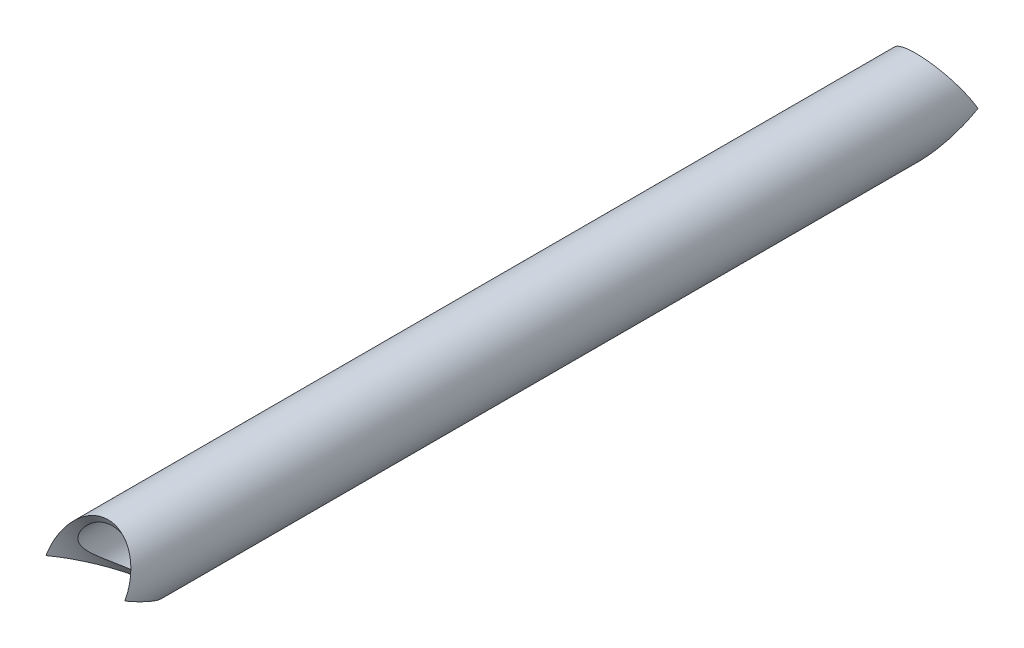
ISO-10303-21;
HEADER;
FILE_DESCRIPTION(('STEP AP214'),'2;1');
FILE_NAME('part.step','',(''),(''),'','','');
FILE_SCHEMA(('AUTOMOTIVE_DESIGN { 1 0 10303 214 1 1 1 1 }'));
ENDSEC;
DATA;
#1=APPLICATION_CONTEXT('core data for automotive mechanical design processes');
#2=APPLICATION_PROTOCOL_DEFINITION('international standard','automotive_design',2000,#1);
#3=PRODUCT_CONTEXT('',#1,'mechanical');
#4=PRODUCT('Part','Part','',(#3));
#5=PRODUCT_RELATED_PRODUCT_CATEGORY('part','',(#4));
#6=PRODUCT_DEFINITION_FORMATION('','',#4);
#7=PRODUCT_DEFINITION_CONTEXT('part definition',#1,'design');
#8=PRODUCT_DEFINITION('design','',#6,#7);
#9=PRODUCT_DEFINITION_SHAPE('','',#8);
#10=(LENGTH_UNIT() NAMED_UNIT(*) SI_UNIT(.MILLI.,.METRE.));
#11=(NAMED_UNIT(*) PLANE_ANGLE_UNIT() SI_UNIT($,.RADIAN.));
#12=(NAMED_UNIT(*) SI_UNIT($,.STERADIAN.) SOLID_ANGLE_UNIT());
#13=UNCERTAINTY_MEASURE_WITH_UNIT(LENGTH_MEASURE(1.E-05),#10,'distance_accuracy_value','');
#14=(GEOMETRIC_REPRESENTATION_CONTEXT(3) GLOBAL_UNCERTAINTY_ASSIGNED_CONTEXT((#13)) GLOBAL_UNIT_ASSIGNED_CONTEXT((#10,
#11,#12)) REPRESENTATION_CONTEXT('',''));
#15=CARTESIAN_POINT('',(0.,0.,0.));
#16=DIRECTION('',(0.,0.,1.));
#17=DIRECTION('',(1.,0.,0.));
#18=AXIS2_PLACEMENT_3D('',#15,#16,#17);
#19=CARTESIAN_POINT('',(9.0632736305644E-13,-189.930080756955,-134.657183252167));
#20=DIRECTION('',(0.,0.,1.));
#21=DIRECTION('',(1.,0.,0.));
#22=AXIS2_PLACEMENT_3D('',#19,#20,#21);
#23=CYLINDRICAL_SURFACE('',#22,10.65);
#24=CARTESIAN_POINT('',(7.08835079549431E-13,-189.930080756955,-115.343816747755));
#25=DIRECTION('',(0.,0.866025403784403,0.500000000000061));
#26=DIRECTION('',(0.,-0.500000000000061,0.866025403784403));
#27=AXIS2_PLACEMENT_3D('',#24,#25,#26);
#28=ELLIPSE('',#27,21.2999999999974,10.65);
#29=CARTESIAN_POINT('',(-10.6499999999993,-189.930080756955,-115.343816747755));
#30=VERTEX_POINT('',#29);
#31=CARTESIAN_POINT('',(10.6500000000007,-189.930080756955,-115.343816747755));
#32=VERTEX_POINT('',#31);
#33=EDGE_CURVE('E46',#30,#32,#28,.T.);
#34=ORIENTED_EDGE('',*,*,#33,.T.);
#35=CARTESIAN_POINT('',(7.08835079549431E-13,-189.930080756955,-115.343816747755));
#36=DIRECTION('',(0.,-0.500000000000061,0.866025403784403));
#37=DIRECTION('',(0.,0.866025403784403,0.500000000000061));
#38=AXIS2_PLACEMENT_3D('',#35,#36,#37);
#39=ELLIPSE('',#38,12.2975607337395,10.65);
#40=EDGE_CURVE('E54',#32,#30,#39,.T.);
#41=ORIENTED_EDGE('',*,*,#40,.T.);
#42=EDGE_LOOP('',(#34,#41));
#43=FACE_BOUND('',#42,.T.);
#44=CARTESIAN_POINT('',(7.08835079549431E-13,-189.930080756955,115.343816747755));
#45=DIRECTION('',(0.,-0.866025403784403,0.500000000000061));
#46=DIRECTION('',(0.,-0.500000000000061,-0.866025403784403));
#47=AXIS2_PLACEMENT_3D('',#44,#45,#46);
#48=ELLIPSE('',#47,21.2999999999974,10.65);
#49=CARTESIAN_POINT('',(-10.6499999999993,-189.930080756955,115.343816747755));
#50=VERTEX_POINT('',#49);
#51=CARTESIAN_POINT('',(10.6500000000007,-189.930080756955,115.343816747755));
#52=VERTEX_POINT('',#51);
#53=EDGE_CURVE('E64',#50,#52,#48,.T.);
#54=ORIENTED_EDGE('',*,*,#53,.F.);
#55=CARTESIAN_POINT('',(7.08835079549431E-13,-189.930080756955,115.343816747755));
#56=DIRECTION('',(0.,0.500000000000061,0.866025403784403));
#57=DIRECTION('',(0.,0.866025403784403,-0.500000000000061));
#58=AXIS2_PLACEMENT_3D('',#55,#56,#57);
#59=ELLIPSE('',#58,12.2975607337395,10.65);
#60=EDGE_CURVE('E62',#52,#50,#59,.T.);
#61=ORIENTED_EDGE('',*,*,#60,.F.);
#62=EDGE_LOOP('',(#54,#61));
#63=FACE_BOUND('',#62,.T.);
#64=ADVANCED_FACE('F35',(#43,#63),#23,.T.);
#65=CARTESIAN_POINT('',(9.0632736305644E-13,-189.930080756955,-134.657183252167));
#66=DIRECTION('',(0.,0.,1.));
#67=DIRECTION('',(1.,0.,0.));
#68=AXIS2_PLACEMENT_3D('',#65,#66,#67);
#69=CYLINDRICAL_SURFACE('',#68,8.65);
#70=CARTESIAN_POINT('',(8.6500000000009,-189.930080756955,-108.169789519855));
#71=CARTESIAN_POINT('',(8.64999937803417,-189.783264674996,-108.254553812138));
#72=CARTESIAN_POINT('',(8.64626274910797,-189.633836481742,-108.334805870728));
#73=CARTESIAN_POINT('',(8.63051404007097,-189.330231408405,-108.484871683348));
#74=CARTESIAN_POINT('',(8.61850310980596,-189.176055190979,-108.554686886105));
#75=CARTESIAN_POINT('',(8.58549136002999,-188.864058425133,-108.682598958273));
#76=CARTESIAN_POINT('',(8.56450206368847,-188.706242792461,-108.740710708202));
#77=CARTESIAN_POINT('',(8.51297710355514,-188.388108659806,-108.844571007219));
#78=CARTESIAN_POINT('',(8.48244146927685,-188.227790167563,-108.890319594529));
#79=CARTESIAN_POINT('',(8.41148621828009,-187.906085352033,-108.969357821528));
#80=CARTESIAN_POINT('',(8.37105601253881,-187.744698066168,-109.002634016221));
#81=CARTESIAN_POINT('',(8.28030697487786,-187.422691275324,-109.057180023759));
#82=CARTESIAN_POINT('',(8.22998781020981,-187.262071796367,-109.0784494325));
#83=CARTESIAN_POINT('',(8.1195591828893,-186.94279898659,-109.110075644665));
#84=CARTESIAN_POINT('',(8.05943008935801,-186.784150299099,-109.120410249233));
#85=CARTESIAN_POINT('',(7.92980127102055,-186.470371161378,-109.131499808874));
#86=CARTESIAN_POINT('',(7.86029883349751,-186.315241744892,-109.132251984681));
#87=CARTESIAN_POINT('',(7.69251740767406,-185.96851090789,-109.124832714029));
#88=CARTESIAN_POINT('',(7.59151815094422,-185.778276477436,-109.114215818048));
#89=CARTESIAN_POINT('',(7.37601667855969,-185.406465672014,-109.083110507501));
#90=CARTESIAN_POINT('',(7.26151062378823,-185.224891779378,-109.062619281164));
#91=CARTESIAN_POINT('',(7.01974442801529,-184.871266755584,-109.014496823818));
#92=CARTESIAN_POINT('',(6.89247464409807,-184.699222979025,-108.986860169229));
#93=CARTESIAN_POINT('',(6.62602035216196,-184.365555584953,-108.926814802504));
#94=CARTESIAN_POINT('',(6.48683667995992,-184.203931237859,-108.894406425013));
#95=CARTESIAN_POINT('',(6.19369921715808,-183.887881348023,-108.825971691326));
#96=CARTESIAN_POINT('',(6.03946719637315,-183.733729014745,-108.789876171454));
#97=CARTESIAN_POINT('',(5.71996280968022,-183.437626174971,-108.716544919955));
#98=CARTESIAN_POINT('',(5.55469039583224,-183.295675721465,-108.679309183378));
#99=CARTESIAN_POINT('',(5.21389860048005,-183.024637527607,-108.605207766052));
#100=CARTESIAN_POINT('',(5.03838164400037,-182.895546762615,-108.568342000129));
#101=CARTESIAN_POINT('',(4.67787691764227,-182.650833994149,-108.496242664774));
#102=CARTESIAN_POINT('',(4.49288897525264,-182.535212236134,-108.461009125096));
#103=CARTESIAN_POINT('',(4.0896393572084,-182.303930255912,-108.388840354413));
#104=CARTESIAN_POINT('',(3.87018262639338,-182.190227595623,-108.352281476196));
#105=CARTESIAN_POINT('',(3.42170434916217,-181.981773276058,-108.283945399977));
#106=CARTESIAN_POINT('',(3.19268197861236,-181.887023253746,-108.252168615069));
#107=CARTESIAN_POINT('',(2.72667233822174,-181.717331774712,-108.194467434728));
#108=CARTESIAN_POINT('',(2.48968464132819,-181.642391381978,-108.168543353658));
#109=CARTESIAN_POINT('',(2.00954587057645,-181.513072445296,-108.123393090809));
#110=CARTESIAN_POINT('',(1.76639521489101,-181.458692510231,-108.104166455888));
#111=CARTESIAN_POINT('',(1.28688815578066,-181.373034380647,-108.073718575009));
#112=CARTESIAN_POINT('',(1.05071773862644,-181.34082751511,-108.062176292036));
#113=CARTESIAN_POINT('',(0.576287751522943,-181.296011057647,-108.046083469695));
#114=CARTESIAN_POINT('',(0.338028232849858,-181.283400986072,-108.041532759202));
#115=CARTESIAN_POINT('',(-0.138694398065081,-181.27790894676,-108.039552924523));
#116=CARTESIAN_POINT('',(-0.377157454409495,-181.285022666651,-108.042122243627));
#117=CARTESIAN_POINT('',(-0.852499060907773,-181.318895198817,-108.054306138062));
#118=CARTESIAN_POINT('',(-1.08937763949893,-181.345653657561,-108.063920586606));
#119=CARTESIAN_POINT('',(-1.55084699909946,-181.417160272854,-108.089426565679));
#120=CARTESIAN_POINT('',(-1.77556361879871,-181.461189550589,-108.105066862876));
#121=CARTESIAN_POINT('',(-2.22033596035068,-181.56677702168,-108.142195625824));
#122=CARTESIAN_POINT('',(-2.44039182888853,-181.628334662492,-108.163683907229));
#123=CARTESIAN_POINT('',(-2.87439182216372,-181.768440967908,-108.211923088911));
#124=CARTESIAN_POINT('',(-3.08833678882489,-181.846987279006,-108.238673260194));
#125=CARTESIAN_POINT('',(-3.50884695014988,-182.020451930229,-108.296692885499));
#126=CARTESIAN_POINT('',(-3.71541192514845,-182.115370757192,-108.327962473902));
#127=CARTESIAN_POINT('',(-4.12561504865862,-182.323755254148,-108.395031462139));
#128=CARTESIAN_POINT('',(-4.32901148650067,-182.437663816104,-108.430932760369));
#129=CARTESIAN_POINT('',(-4.72560996425136,-182.681268767221,-108.505363145942));
#130=CARTESIAN_POINT('',(-4.91881176220126,-182.810965530856,-108.543892295604));
#131=CARTESIAN_POINT('',(-5.29426000335195,-183.085558733724,-108.622226257415));
#132=CARTESIAN_POINT('',(-5.47649012979038,-183.230476972353,-108.662032840823));
#133=CARTESIAN_POINT('',(-5.82873985001055,-183.534579536099,-108.741182784621));
#134=CARTESIAN_POINT('',(-5.99875927649411,-183.69376405661,-108.780526138658));
#135=CARTESIAN_POINT('',(-6.33518765876964,-184.035283085524,-108.858947720858));
#136=CARTESIAN_POINT('',(-6.50081325634355,-184.218425197733,-108.897877805572));
#137=CARTESIAN_POINT('',(-6.81634213928475,-184.598939018006,-108.970062290426));
#138=CARTESIAN_POINT('',(-6.96624167784238,-184.796314098326,-109.003315339162));
#139=CARTESIAN_POINT('',(-7.24880778216951,-185.203706994468,-109.060509557228));
#140=CARTESIAN_POINT('',(-7.38151120832184,-185.413696307143,-109.084470871124));
#141=CARTESIAN_POINT('',(-7.62872444595231,-185.845138231175,-109.118913729455));
#142=CARTESIAN_POINT('',(-7.74324661530684,-186.066582919356,-109.129404464573));
#143=CARTESIAN_POINT('',(-7.9158766152872,-186.439021957776,-109.131660793055));
#144=CARTESIAN_POINT('',(-7.97965328460061,-186.587379578665,-109.128717442631));
#145=CARTESIAN_POINT('',(-8.09865941914336,-186.887027428737,-109.113865684182));
#146=CARTESIAN_POINT('',(-8.15389168150528,-187.038316679883,-109.101960217552));
#147=CARTESIAN_POINT('',(-8.25543809691455,-187.342438268084,-109.068058126733));
#148=CARTESIAN_POINT('',(-8.30176915263701,-187.495267088722,-109.046080902259));
#149=CARTESIAN_POINT('',(-8.38549388456829,-187.801425095008,-108.99119286605));
#150=CARTESIAN_POINT('',(-8.42288752849188,-187.95475428246,-108.958282014819));
#151=CARTESIAN_POINT('',(-8.48887463244731,-188.260918126934,-108.881026848117));
#152=CARTESIAN_POINT('',(-8.51744234753681,-188.413750074128,-108.836649764691));
#153=CARTESIAN_POINT('',(-8.56590540255602,-188.7170837474,-108.736664024626));
#154=CARTESIAN_POINT('',(-8.58580081854648,-188.867585493904,-108.681055466499));
#155=CARTESIAN_POINT('',(-8.61742448664767,-189.165272229515,-108.559202943972));
#156=CARTESIAN_POINT('',(-8.62914387610687,-189.31245345259,-108.492947533978));
#157=CARTESIAN_POINT('',(-8.64501885033527,-189.602561451232,-108.350865711014));
#158=CARTESIAN_POINT('',(-8.64917188259911,-189.745486775085,-108.275036077408));
#159=CARTESIAN_POINT('',(-8.65091176420794,-190.087030620736,-108.080636711765));
#160=CARTESIAN_POINT('',(-8.6449099197872,-190.28318795917,-107.957703743347));
#161=CARTESIAN_POINT('',(-8.62080404537239,-190.665606330808,-107.69839276968));
#162=CARTESIAN_POINT('',(-8.60269349220052,-190.851861971375,-107.562007551242));
#163=CARTESIAN_POINT('',(-8.55591593176056,-191.215588142947,-107.27857318699));
#164=CARTESIAN_POINT('',(-8.5272145391972,-191.393027898152,-107.131490572933));
#165=CARTESIAN_POINT('',(-8.46048539057239,-191.73944947881,-106.829617762232));
#166=CARTESIAN_POINT('',(-8.42245385331444,-191.908427841629,-106.674824461024));
#167=CARTESIAN_POINT('',(-8.33930780952848,-192.233482965,-106.36473470451));
#168=CARTESIAN_POINT('',(-8.2944623361026,-192.389800272962,-106.209616629138));
#169=CARTESIAN_POINT('',(-8.19738755509959,-192.696151819373,-105.895606806597));
#170=CARTESIAN_POINT('',(-8.14515935111339,-192.846186992556,-105.73671562639));
#171=CARTESIAN_POINT('',(-8.03358147622542,-193.140828955438,-105.416145966448));
#172=CARTESIAN_POINT('',(-7.97422521882651,-193.285430559903,-105.25446502886));
#173=CARTESIAN_POINT('',(-7.84858289044724,-193.569639355006,-104.929390007646));
#174=CARTESIAN_POINT('',(-7.7822960538325,-193.709245991549,-104.765995736541));
#175=CARTESIAN_POINT('',(-7.64278789689105,-193.983972723712,-104.438214400627));
#176=CARTESIAN_POINT('',(-7.56956237191807,-194.119090031087,-104.273826791096));
#177=CARTESIAN_POINT('',(-7.41613086611487,-194.385086648004,-103.94485285179));
#178=CARTESIAN_POINT('',(-7.33592422353037,-194.515965554162,-103.780266504639));
#179=CARTESIAN_POINT('',(-7.16842967186039,-194.77360305074,-103.451680828192));
#180=CARTESIAN_POINT('',(-7.08114669097882,-194.900364424026,-103.287681172015));
#181=CARTESIAN_POINT('',(-6.89920629382284,-195.149975224742,-102.960798311949));
#182=CARTESIAN_POINT('',(-6.80454875726894,-195.27282458832,-102.797915126316));
#183=CARTESIAN_POINT('',(-6.56519981119171,-195.566605524496,-102.40428389218));
#184=CARTESIAN_POINT('',(-6.41648661666436,-195.7355148502,-102.17444941504));
#185=CARTESIAN_POINT('',(-6.10210401419073,-196.065119377039,-101.720441483567));
#186=CARTESIAN_POINT('',(-5.93643204735787,-196.225813333067,-101.496268889929));
#187=CARTESIAN_POINT('',(-5.58706670598611,-196.537796432091,-101.05665010599));
#188=CARTESIAN_POINT('',(-5.40341885193458,-196.689107823162,-100.841183730397));
#189=CARTESIAN_POINT('',(-5.01605964050903,-196.981356654879,-100.421588491406));
#190=CARTESIAN_POINT('',(-4.81235869354333,-197.122299412607,-100.217453830422));
#191=CARTESIAN_POINT('',(-4.4639543153773,-197.340916757968,-99.8986979964682));
#192=CARTESIAN_POINT('',(-4.32596965085751,-197.42240729232,-99.7793498344447));
#193=CARTESIAN_POINT('',(-4.04104693269411,-197.579848974194,-99.5479148246745));
#194=CARTESIAN_POINT('',(-3.89410768993987,-197.655799383068,-99.4358289454077));
#195=CARTESIAN_POINT('',(-3.4395362282074,-197.873944188166,-99.1128683237676));
#196=CARTESIAN_POINT('',(-3.11767000653522,-198.00674128604,-98.9148381206735));
#197=CARTESIAN_POINT('',(-2.51329904826328,-198.211567578748,-98.6081351365987));
#198=CARTESIAN_POINT('',(-2.23837288737234,-198.290547803417,-98.4893822395522));
#199=CARTESIAN_POINT('',(-1.81149183588474,-198.389536700987,-98.3402307692878));
#200=CARTESIAN_POINT('',(-1.6667769628438,-198.41928686878,-98.2953420807146));
#201=CARTESIAN_POINT('',(-1.3732376326574,-198.471679420336,-98.2162210175355));
#202=CARTESIAN_POINT('',(-1.22441515227342,-198.494325160344,-98.181983611158));
#203=CARTESIAN_POINT('',(-0.922228530534084,-198.532138309608,-98.1247830542755));
#204=CARTESIAN_POINT('',(-0.768835207761977,-198.547235025687,-98.1019264882869));
#205=CARTESIAN_POINT('',(-0.46011120993838,-198.569220722579,-98.068631455004));
#206=CARTESIAN_POINT('',(-0.304780550295992,-198.576109768632,-98.0581928890036));
#207=CARTESIAN_POINT('',(0.00631804623187532,-198.581476991314,-98.0500607025686));
#208=CARTESIAN_POINT('',(0.162085851107491,-198.5799574806,-98.0523635777774));
#209=CARTESIAN_POINT('',(0.472597570433522,-198.568557828703,-98.069633936411));
#210=CARTESIAN_POINT('',(0.627341552835046,-198.558678248104,-98.0846005706693));
#211=CARTESIAN_POINT('',(0.914629127249763,-198.532638689337,-98.1240216912087));
#212=CARTESIAN_POINT('',(1.04746675019335,-198.517450654638,-98.1470071670895));
#213=CARTESIAN_POINT('',(1.31053948151426,-198.481258248787,-98.2017371636456));
#214=CARTESIAN_POINT('',(1.4407737859712,-198.460252109833,-98.2334843465095));
#215=CARTESIAN_POINT('',(1.8265094283439,-198.389077764845,-98.3409455682366));
#216=CARTESIAN_POINT('',(2.07716005820184,-198.330742558399,-98.4288961060872));
#217=CARTESIAN_POINT('',(2.677010449642,-198.163787493924,-98.6798415466375));
#218=CARTESIAN_POINT('',(3.01657143771907,-198.04444052964,-98.8586449484407));
#219=CARTESIAN_POINT('',(3.4969438802439,-197.843627765568,-99.1575546718874));
#220=CARTESIAN_POINT('',(3.65245291749773,-197.772934680177,-99.2624906726672));
#221=CARTESIAN_POINT('',(3.95415605806277,-197.625228633007,-99.4809699570006));
#222=CARTESIAN_POINT('',(4.10035178316956,-197.548216776936,-99.5945117343848));
#223=CARTESIAN_POINT('',(4.47217067277796,-197.338994382108,-99.9017383815067));
#224=CARTESIAN_POINT('',(4.69046621582164,-197.202312631268,-100.101242865584));
#225=CARTESIAN_POINT('',(5.10542040242059,-196.917252986393,-100.513982184383));
#226=CARTESIAN_POINT('',(5.30206445824787,-196.768867320966,-100.727226124592));
#227=CARTESIAN_POINT('',(5.67619689273809,-196.461701005763,-101.164384294701));
#228=CARTESIAN_POINT('',(5.85361633779509,-196.302886028447,-101.388333025683));
#229=CARTESIAN_POINT('',(6.19021131260067,-195.976462879584,-101.843247922683));
#230=CARTESIAN_POINT('',(6.34939068741001,-195.808856572177,-102.074212596685));
#231=CARTESIAN_POINT('',(6.61712450602791,-195.503908562381,-102.488481148718));
#232=CARTESIAN_POINT('',(6.72902472853625,-195.368213027809,-102.670852703075));
#233=CARTESIAN_POINT('',(6.94326792392789,-195.091873656927,-103.037486844069));
#234=CARTESIAN_POINT('',(7.04560988610163,-194.95122929948,-103.221749628406));
#235=CARTESIAN_POINT('',(7.24122557898553,-194.664768028116,-103.591407563522));
#236=CARTESIAN_POINT('',(7.33449006193127,-194.518946041586,-103.77680366875));
#237=CARTESIAN_POINT('',(7.51210861764743,-194.222009786335,-104.147609115909));
#238=CARTESIAN_POINT('',(7.59646314201745,-194.070895786358,-104.333018456692));
#239=CARTESIAN_POINT('',(7.7562033711046,-193.763325616376,-104.702402158837));
#240=CARTESIAN_POINT('',(7.83161100983245,-193.606883774214,-104.886378951162));
#241=CARTESIAN_POINT('',(7.97368173187842,-193.287673332181,-105.25226324286));
#242=CARTESIAN_POINT('',(8.04034383363496,-193.124904024795,-105.434170507868));
#243=CARTESIAN_POINT('',(8.16459670931799,-192.792476491618,-105.794291758842));
#244=CARTESIAN_POINT('',(8.22219981237354,-192.622828031039,-105.972510472711));
#245=CARTESIAN_POINT('',(8.3279413403157,-192.275470820415,-106.323768111329));
#246=CARTESIAN_POINT('',(8.37608284212318,-192.097764713938,-106.496808704437));
#247=CARTESIAN_POINT('',(8.45472823516557,-191.764250235384,-106.806582126786));
#248=CARTESIAN_POINT('',(8.48684042867091,-191.609892877515,-106.944464161029));
#249=CARTESIAN_POINT('',(8.54328935211283,-191.294062265692,-107.213577397716));
#250=CARTESIAN_POINT('',(8.56762596647598,-191.132588906008,-107.344808501278));
#251=CARTESIAN_POINT('',(8.60751619567218,-190.80229955061,-107.598297745807));
#252=CARTESIAN_POINT('',(8.62309164938136,-190.633502952202,-107.720577531134));
#253=CARTESIAN_POINT('',(8.64433263886671,-190.287817579566,-107.954115038892));
#254=CARTESIAN_POINT('',(8.65000076614854,-190.110930933916,-108.065375636479));
#255=CARTESIAN_POINT('',(8.6500000000009,-189.930080756955,-108.169789519855));
#256=B_SPLINE_CURVE_WITH_KNOTS('',3,(#70,#71,#72,#73,#74,#75,#76,#77,#78,#79,#80,#81,#82,#83,
#84,#85,#86,#87,#88,#89,#90,#91,#92,#93,#94,#95,#96,#97,#98,#99,#100,#101,#102,#103,#104,#105,
#106,#107,#108,#109,#110,#111,#112,#113,#114,#115,#116,#117,#118,#119,#120,#121,#122,#123,#124,
#125,#126,#127,#128,#129,#130,#131,#132,#133,#134,#135,#136,#137,#138,#139,#140,#141,#142,#143,
#144,#145,#146,#147,#148,#149,#150,#151,#152,#153,#154,#155,#156,#157,#158,#159,#160,#161,#162,
#163,#164,#165,#166,#167,#168,#169,#170,#171,#172,#173,#174,#175,#176,#177,#178,#179,#180,#181,
#182,#183,#184,#185,#186,#187,#188,#189,#190,#191,#192,#193,#194,#195,#196,#197,#198,#199,#200,
#201,#202,#203,#204,#205,#206,#207,#208,#209,#210,#211,#212,#213,#214,#215,#216,#217,#218,#219,
#220,#221,#222,#223,#224,#225,#226,#227,#228,#229,#230,#231,#232,#233,#234,#235,#236,#237,#238,
#239,#240,#241,#242,#243,#244,#245,#246,#247,#248,#249,#250,#251,#252,#253,#254,#255),
.UNSPECIFIED.,.T.,.F.,(4,2,2,2,2,2,2,2,2,2,2,2,2,2,2,2,2,2,2,2,2,2,2,2,2,2,2,2,2,2,2,2,2,2,2,2,
2,2,2,2,2,2,2,2,2,2,2,2,2,2,2,2,2,2,2,2,2,2,2,2,2,2,2,2,2,2,2,2,2,2,2,2,2,2,2,2,2,2,2,2,2,2,2,2,
2,2,2,2,2,2,2,2,4),(0.,0.50844506770032,1.01681949312019,1.52454340032978,2.03226573787235,
2.54053382673726,3.04881902097636,3.55813412185317,4.06759693996531,4.71359002947249,
5.35976717786677,6.00643624012414,6.65305997254474,7.3155184468507,7.97797979789332,
8.6402849662054,9.30260220250553,10.0512091879151,10.7998808036044,11.5485926227776,
12.2972537751968,13.0122575701416,13.7272438644487,14.4420738478246,15.156890967233,
15.8446653307736,16.5324180161264,17.2200754854148,17.9077534057857,18.6145823037831,
19.3214279700605,20.029300114905,20.7371819564202,21.4861817527539,22.2353595985674,
22.982904015949,23.7299381285008,24.2140392664682,24.6979815901782,25.180995661056,
25.6640114767329,26.1484232132305,26.6328307010897,27.117762464654,27.6028577893435,
28.2964167818696,28.9903497083937,29.6865557409421,30.3830443900299,31.0569944659832,
31.730843904349,32.4053208577866,33.0798724008736,33.7548353491973,34.4298623484518,
35.1044232089345,35.7789950738538,36.7434305731186,37.7080118098811,38.6702106916392,
39.6319126633935,40.2309613246267,40.8300897097657,42.0261773485565,42.951559231629,
43.4142860297684,43.8767938980604,44.3435554209343,44.8103132336662,45.2769426775157,
45.7435408340744,46.1500870679644,46.5567569645804,47.3697458590114,48.5683011522663,
49.1693990091057,49.7703919045981,50.7462014804333,51.7226645377541,52.7025204724633,
53.6821694691644,54.4420360299657,55.2019828498199,55.962695941976,56.723370459009,
57.4821398028629,58.2409942350118,58.9988067717563,59.7563724579486,60.3844095628078,
61.0124560021507,61.6389298975942,62.2652398987969),.UNSPECIFIED.);
#257=CARTESIAN_POINT('',(8.6500000000009,-189.930080756955,-108.169789519855));
#258=VERTEX_POINT('',#257);
#259=EDGE_CURVE('E11',#258,#258,#256,.T.);
#260=ORIENTED_EDGE('',*,*,#259,.F.);
#261=EDGE_LOOP('',(#260));
#262=FACE_BOUND('',#261,.T.);
#263=CARTESIAN_POINT('',(8.6500000000009,-189.930080756955,108.169789519855));
#264=CARTESIAN_POINT('',(8.64999937803417,-189.783264674996,108.254553812138));
#265=CARTESIAN_POINT('',(8.64626274910797,-189.633836481742,108.334805870728));
#266=CARTESIAN_POINT('',(8.63051404007097,-189.330231408405,108.484871683348));
#267=CARTESIAN_POINT('',(8.61850310980596,-189.176055190979,108.554686886105));
#268=CARTESIAN_POINT('',(8.58549136002999,-188.864058425133,108.682598958273));
#269=CARTESIAN_POINT('',(8.56450206368847,-188.706242792461,108.740710708202));
#270=CARTESIAN_POINT('',(8.51297710355514,-188.388108659806,108.844571007219));
#271=CARTESIAN_POINT('',(8.48244146927685,-188.227790167563,108.890319594529));
#272=CARTESIAN_POINT('',(8.41148621828009,-187.906085352033,108.969357821528));
#273=CARTESIAN_POINT('',(8.37105601253881,-187.744698066168,109.002634016221));
#274=CARTESIAN_POINT('',(8.28030697487786,-187.422691275324,109.057180023759));
#275=CARTESIAN_POINT('',(8.22998781020981,-187.262071796367,109.0784494325));
#276=CARTESIAN_POINT('',(8.1195591828893,-186.94279898659,109.110075644665));
#277=CARTESIAN_POINT('',(8.05943008935801,-186.784150299099,109.120410249233));
#278=CARTESIAN_POINT('',(7.92980127102055,-186.470371161378,109.131499808874));
#279=CARTESIAN_POINT('',(7.86029883349751,-186.315241744892,109.132251984681));
#280=CARTESIAN_POINT('',(7.69251740767406,-185.96851090789,109.124832714029));
#281=CARTESIAN_POINT('',(7.59151815094422,-185.778276477436,109.114215818048));
#282=CARTESIAN_POINT('',(7.37601667855969,-185.406465672014,109.083110507501));
#283=CARTESIAN_POINT('',(7.26151062378823,-185.224891779378,109.062619281164));
#284=CARTESIAN_POINT('',(7.01974442801529,-184.871266755584,109.014496823818));
#285=CARTESIAN_POINT('',(6.89247464409807,-184.699222979025,108.986860169229));
#286=CARTESIAN_POINT('',(6.62602035216196,-184.365555584953,108.926814802504));
#287=CARTESIAN_POINT('',(6.48683667995992,-184.203931237859,108.894406425013));
#288=CARTESIAN_POINT('',(6.19369921715808,-183.887881348023,108.825971691326));
#289=CARTESIAN_POINT('',(6.03946719637315,-183.733729014745,108.789876171454));
#290=CARTESIAN_POINT('',(5.71996280968022,-183.437626174971,108.716544919955));
#291=CARTESIAN_POINT('',(5.55469039583224,-183.295675721465,108.679309183378));
#292=CARTESIAN_POINT('',(5.21389860048005,-183.024637527607,108.605207766052));
#293=CARTESIAN_POINT('',(5.03838164400037,-182.895546762615,108.568342000129));
#294=CARTESIAN_POINT('',(4.67787691764227,-182.650833994149,108.496242664774));
#295=CARTESIAN_POINT('',(4.49288897525264,-182.535212236134,108.461009125096));
#296=CARTESIAN_POINT('',(4.0896393572084,-182.303930255912,108.388840354413));
#297=CARTESIAN_POINT('',(3.87018262639338,-182.190227595623,108.352281476196));
#298=CARTESIAN_POINT('',(3.42170434916217,-181.981773276058,108.283945399977));
#299=CARTESIAN_POINT('',(3.19268197861236,-181.887023253746,108.252168615069));
#300=CARTESIAN_POINT('',(2.72667233822174,-181.717331774712,108.194467434728));
#301=CARTESIAN_POINT('',(2.48968464132819,-181.642391381978,108.168543353658));
#302=CARTESIAN_POINT('',(2.00954587057645,-181.513072445296,108.123393090809));
#303=CARTESIAN_POINT('',(1.76639521489101,-181.458692510231,108.104166455888));
#304=CARTESIAN_POINT('',(1.28688815578066,-181.373034380647,108.073718575009));
#305=CARTESIAN_POINT('',(1.05071773862644,-181.34082751511,108.062176292036));
#306=CARTESIAN_POINT('',(0.576287751522943,-181.296011057647,108.046083469695));
#307=CARTESIAN_POINT('',(0.338028232849858,-181.283400986072,108.041532759202));
#308=CARTESIAN_POINT('',(-0.138694398065081,-181.27790894676,108.039552924523));
#309=CARTESIAN_POINT('',(-0.377157454409495,-181.285022666651,108.042122243627));
#310=CARTESIAN_POINT('',(-0.852499060907773,-181.318895198817,108.054306138062));
#311=CARTESIAN_POINT('',(-1.08937763949893,-181.345653657561,108.063920586606));
#312=CARTESIAN_POINT('',(-1.55084699909946,-181.417160272854,108.089426565679));
#313=CARTESIAN_POINT('',(-1.77556361879871,-181.461189550589,108.105066862876));
#314=CARTESIAN_POINT('',(-2.22033596035068,-181.56677702168,108.142195625824));
#315=CARTESIAN_POINT('',(-2.44039182888853,-181.628334662492,108.163683907229));
#316=CARTESIAN_POINT('',(-2.87439182216372,-181.768440967908,108.211923088911));
#317=CARTESIAN_POINT('',(-3.08833678882489,-181.846987279006,108.238673260194));
#318=CARTESIAN_POINT('',(-3.50884695014988,-182.020451930229,108.296692885499));
#319=CARTESIAN_POINT('',(-3.71541192514845,-182.115370757192,108.327962473902));
#320=CARTESIAN_POINT('',(-4.12561504865862,-182.323755254148,108.395031462139));
#321=CARTESIAN_POINT('',(-4.32901148650067,-182.437663816104,108.430932760369));
#322=CARTESIAN_POINT('',(-4.72560996425136,-182.681268767221,108.505363145942));
#323=CARTESIAN_POINT('',(-4.91881176220126,-182.810965530856,108.543892295604));
#324=CARTESIAN_POINT('',(-5.29426000335195,-183.085558733724,108.622226257415));
#325=CARTESIAN_POINT('',(-5.47649012979038,-183.230476972353,108.662032840823));
#326=CARTESIAN_POINT('',(-5.82873985001055,-183.534579536099,108.741182784621));
#327=CARTESIAN_POINT('',(-5.99875927649411,-183.69376405661,108.780526138658));
#328=CARTESIAN_POINT('',(-6.33518765876964,-184.035283085524,108.858947720858));
#329=CARTESIAN_POINT('',(-6.50081325634355,-184.218425197733,108.897877805572));
#330=CARTESIAN_POINT('',(-6.81634213928475,-184.598939018006,108.970062290426));
#331=CARTESIAN_POINT('',(-6.96624167784238,-184.796314098326,109.003315339162));
#332=CARTESIAN_POINT('',(-7.24880778216951,-185.203706994468,109.060509557228));
#333=CARTESIAN_POINT('',(-7.38151120832184,-185.413696307143,109.084470871124));
#334=CARTESIAN_POINT('',(-7.62872444595231,-185.845138231175,109.118913729455));
#335=CARTESIAN_POINT('',(-7.74324661530684,-186.066582919356,109.129404464573));
#336=CARTESIAN_POINT('',(-7.9158766152872,-186.439021957776,109.131660793055));
#337=CARTESIAN_POINT('',(-7.97965328460061,-186.587379578665,109.128717442631));
#338=CARTESIAN_POINT('',(-8.09865941914336,-186.887027428737,109.113865684182));
#339=CARTESIAN_POINT('',(-8.15389168150528,-187.038316679883,109.101960217552));
#340=CARTESIAN_POINT('',(-8.25543809691455,-187.342438268084,109.068058126733));
#341=CARTESIAN_POINT('',(-8.30176915263701,-187.495267088722,109.046080902259));
#342=CARTESIAN_POINT('',(-8.38549388456829,-187.801425095008,108.99119286605));
#343=CARTESIAN_POINT('',(-8.42288752849188,-187.95475428246,108.958282014819));
#344=CARTESIAN_POINT('',(-8.48887463244731,-188.260918126934,108.881026848117));
#345=CARTESIAN_POINT('',(-8.51744234753681,-188.413750074128,108.836649764691));
#346=CARTESIAN_POINT('',(-8.56590540255602,-188.7170837474,108.736664024626));
#347=CARTESIAN_POINT('',(-8.58580081854648,-188.867585493904,108.681055466499));
#348=CARTESIAN_POINT('',(-8.61742448664767,-189.165272229515,108.559202943972));
#349=CARTESIAN_POINT('',(-8.62914387610687,-189.31245345259,108.492947533978));
#350=CARTESIAN_POINT('',(-8.64501885033527,-189.602561451232,108.350865711014));
#351=CARTESIAN_POINT('',(-8.64917188259911,-189.745486775085,108.275036077408));
#352=CARTESIAN_POINT('',(-8.65091176420794,-190.087030620736,108.080636711765));
#353=CARTESIAN_POINT('',(-8.6449099197872,-190.28318795917,107.957703743347));
#354=CARTESIAN_POINT('',(-8.62080404537239,-190.665606330808,107.69839276968));
#355=CARTESIAN_POINT('',(-8.60269349220052,-190.851861971375,107.562007551242));
#356=CARTESIAN_POINT('',(-8.55591593176056,-191.215588142947,107.27857318699));
#357=CARTESIAN_POINT('',(-8.5272145391972,-191.393027898152,107.131490572933));
#358=CARTESIAN_POINT('',(-8.46048539057239,-191.73944947881,106.829617762232));
#359=CARTESIAN_POINT('',(-8.42245385331444,-191.908427841629,106.674824461024));
#360=CARTESIAN_POINT('',(-8.33930780952848,-192.233482965,106.36473470451));
#361=CARTESIAN_POINT('',(-8.2944623361026,-192.389800272962,106.209616629138));
#362=CARTESIAN_POINT('',(-8.19738755509959,-192.696151819373,105.895606806597));
#363=CARTESIAN_POINT('',(-8.14515935111339,-192.846186992556,105.73671562639));
#364=CARTESIAN_POINT('',(-8.03358147622542,-193.140828955438,105.416145966448));
#365=CARTESIAN_POINT('',(-7.97422521882651,-193.285430559903,105.25446502886));
#366=CARTESIAN_POINT('',(-7.84858289044724,-193.569639355006,104.929390007646));
#367=CARTESIAN_POINT('',(-7.7822960538325,-193.709245991549,104.765995736541));
#368=CARTESIAN_POINT('',(-7.64278789689105,-193.983972723712,104.438214400627));
#369=CARTESIAN_POINT('',(-7.56956237191807,-194.119090031087,104.273826791096));
#370=CARTESIAN_POINT('',(-7.41613086611487,-194.385086648004,103.94485285179));
#371=CARTESIAN_POINT('',(-7.33592422353037,-194.515965554162,103.780266504639));
#372=CARTESIAN_POINT('',(-7.16842967186039,-194.77360305074,103.451680828192));
#373=CARTESIAN_POINT('',(-7.08114669097882,-194.900364424026,103.287681172015));
#374=CARTESIAN_POINT('',(-6.89920629382284,-195.149975224742,102.960798311949));
#375=CARTESIAN_POINT('',(-6.80454875726894,-195.27282458832,102.797915126316));
#376=CARTESIAN_POINT('',(-6.56519981119171,-195.566605524496,102.40428389218));
#377=CARTESIAN_POINT('',(-6.41648661666436,-195.7355148502,102.17444941504));
#378=CARTESIAN_POINT('',(-6.10210401419073,-196.065119377039,101.720441483567));
#379=CARTESIAN_POINT('',(-5.93643204735787,-196.225813333067,101.496268889929));
#380=CARTESIAN_POINT('',(-5.58706670598611,-196.537796432091,101.05665010599));
#381=CARTESIAN_POINT('',(-5.40341885193458,-196.689107823162,100.841183730397));
#382=CARTESIAN_POINT('',(-5.01605964050903,-196.981356654879,100.421588491406));
#383=CARTESIAN_POINT('',(-4.81235869354333,-197.122299412607,100.217453830422));
#384=CARTESIAN_POINT('',(-4.4639543153773,-197.340916757968,99.8986979964682));
#385=CARTESIAN_POINT('',(-4.32596965085751,-197.42240729232,99.7793498344447));
#386=CARTESIAN_POINT('',(-4.04104693269411,-197.579848974194,99.5479148246745));
#387=CARTESIAN_POINT('',(-3.89410768993987,-197.655799383068,99.4358289454077));
#388=CARTESIAN_POINT('',(-3.4395362282074,-197.873944188166,99.1128683237676));
#389=CARTESIAN_POINT('',(-3.11767000653522,-198.00674128604,98.9148381206735));
#390=CARTESIAN_POINT('',(-2.51329904826328,-198.211567578748,98.6081351365987));
#391=CARTESIAN_POINT('',(-2.23837288737234,-198.290547803417,98.4893822395522));
#392=CARTESIAN_POINT('',(-1.81149183588474,-198.389536700987,98.3402307692878));
#393=CARTESIAN_POINT('',(-1.6667769628438,-198.41928686878,98.2953420807146));
#394=CARTESIAN_POINT('',(-1.3732376326574,-198.471679420336,98.2162210175355));
#395=CARTESIAN_POINT('',(-1.22441515227342,-198.494325160344,98.181983611158));
#396=CARTESIAN_POINT('',(-0.922228530534084,-198.532138309608,98.1247830542755));
#397=CARTESIAN_POINT('',(-0.768835207761977,-198.547235025687,98.1019264882869));
#398=CARTESIAN_POINT('',(-0.46011120993838,-198.569220722579,98.068631455004));
#399=CARTESIAN_POINT('',(-0.304780550295992,-198.576109768632,98.0581928890036));
#400=CARTESIAN_POINT('',(0.00631804623187532,-198.581476991314,98.0500607025686));
#401=CARTESIAN_POINT('',(0.162085851107491,-198.5799574806,98.0523635777774));
#402=CARTESIAN_POINT('',(0.472597570433522,-198.568557828703,98.069633936411));
#403=CARTESIAN_POINT('',(0.627341552835046,-198.558678248104,98.0846005706693));
#404=CARTESIAN_POINT('',(0.914629127249763,-198.532638689337,98.1240216912087));
#405=CARTESIAN_POINT('',(1.04746675019335,-198.517450654638,98.1470071670895));
#406=CARTESIAN_POINT('',(1.31053948151426,-198.481258248787,98.2017371636456));
#407=CARTESIAN_POINT('',(1.4407737859712,-198.460252109833,98.2334843465095));
#408=CARTESIAN_POINT('',(1.8265094283439,-198.389077764845,98.3409455682366));
#409=CARTESIAN_POINT('',(2.07716005820184,-198.330742558399,98.4288961060872));
#410=CARTESIAN_POINT('',(2.677010449642,-198.163787493924,98.6798415466375));
#411=CARTESIAN_POINT('',(3.01657143771907,-198.04444052964,98.8586449484407));
#412=CARTESIAN_POINT('',(3.4969438802439,-197.843627765568,99.1575546718874));
#413=CARTESIAN_POINT('',(3.65245291749773,-197.772934680177,99.2624906726672));
#414=CARTESIAN_POINT('',(3.95415605806277,-197.625228633007,99.4809699570006));
#415=CARTESIAN_POINT('',(4.10035178316956,-197.548216776936,99.5945117343848));
#416=CARTESIAN_POINT('',(4.47217067277796,-197.338994382108,99.9017383815067));
#417=CARTESIAN_POINT('',(4.69046621582164,-197.202312631268,100.101242865584));
#418=CARTESIAN_POINT('',(5.10542040242059,-196.917252986393,100.513982184383));
#419=CARTESIAN_POINT('',(5.30206445824787,-196.768867320966,100.727226124592));
#420=CARTESIAN_POINT('',(5.67619689273809,-196.461701005763,101.164384294701));
#421=CARTESIAN_POINT('',(5.85361633779509,-196.302886028447,101.388333025683));
#422=CARTESIAN_POINT('',(6.19021131260067,-195.976462879584,101.843247922683));
#423=CARTESIAN_POINT('',(6.34939068741001,-195.808856572177,102.074212596685));
#424=CARTESIAN_POINT('',(6.61712450602791,-195.503908562381,102.488481148718));
#425=CARTESIAN_POINT('',(6.72902472853625,-195.368213027809,102.670852703075));
#426=CARTESIAN_POINT('',(6.94326792392789,-195.091873656927,103.037486844069));
#427=CARTESIAN_POINT('',(7.04560988610163,-194.95122929948,103.221749628406));
#428=CARTESIAN_POINT('',(7.24122557898553,-194.664768028116,103.591407563522));
#429=CARTESIAN_POINT('',(7.33449006193127,-194.518946041586,103.77680366875));
#430=CARTESIAN_POINT('',(7.51210861764743,-194.222009786335,104.147609115909));
#431=CARTESIAN_POINT('',(7.59646314201745,-194.070895786358,104.333018456692));
#432=CARTESIAN_POINT('',(7.7562033711046,-193.763325616376,104.702402158837));
#433=CARTESIAN_POINT('',(7.83161100983245,-193.606883774214,104.886378951162));
#434=CARTESIAN_POINT('',(7.97368173187842,-193.287673332181,105.25226324286));
#435=CARTESIAN_POINT('',(8.04034383363496,-193.124904024795,105.434170507868));
#436=CARTESIAN_POINT('',(8.16459670931799,-192.792476491618,105.794291758842));
#437=CARTESIAN_POINT('',(8.22219981237354,-192.622828031039,105.972510472711));
#438=CARTESIAN_POINT('',(8.3279413403157,-192.275470820415,106.323768111329));
#439=CARTESIAN_POINT('',(8.37608284212318,-192.097764713938,106.496808704437));
#440=CARTESIAN_POINT('',(8.45472823516557,-191.764250235384,106.806582126786));
#441=CARTESIAN_POINT('',(8.48684042867091,-191.609892877515,106.944464161029));
#442=CARTESIAN_POINT('',(8.54328935211283,-191.294062265692,107.213577397716));
#443=CARTESIAN_POINT('',(8.56762596647598,-191.132588906008,107.344808501278));
#444=CARTESIAN_POINT('',(8.60751619567218,-190.80229955061,107.598297745807));
#445=CARTESIAN_POINT('',(8.62309164938136,-190.633502952202,107.720577531134));
#446=CARTESIAN_POINT('',(8.64433263886671,-190.287817579566,107.954115038892));
#447=CARTESIAN_POINT('',(8.65000076614854,-190.110930933916,108.065375636479));
#448=CARTESIAN_POINT('',(8.6500000000009,-189.930080756955,108.169789519855));
#449=B_SPLINE_CURVE_WITH_KNOTS('',3,(#263,#264,#265,#266,#267,#268,#269,#270,#271,#272,#273,
#274,#275,#276,#277,#278,#279,#280,#281,#282,#283,#284,#285,#286,#287,#288,#289,#290,#291,#292,
#293,#294,#295,#296,#297,#298,#299,#300,#301,#302,#303,#304,#305,#306,#307,#308,#309,#310,#311,
#312,#313,#314,#315,#316,#317,#318,#319,#320,#321,#322,#323,#324,#325,#326,#327,#328,#329,#330,
#331,#332,#333,#334,#335,#336,#337,#338,#339,#340,#341,#342,#343,#344,#345,#346,#347,#348,#349,
#350,#351,#352,#353,#354,#355,#356,#357,#358,#359,#360,#361,#362,#363,#364,#365,#366,#367,#368,
#369,#370,#371,#372,#373,#374,#375,#376,#377,#378,#379,#380,#381,#382,#383,#384,#385,#386,#387,
#388,#389,#390,#391,#392,#393,#394,#395,#396,#397,#398,#399,#400,#401,#402,#403,#404,#405,#406,
#407,#408,#409,#410,#411,#412,#413,#414,#415,#416,#417,#418,#419,#420,#421,#422,#423,#424,#425,
#426,#427,#428,#429,#430,#431,#432,#433,#434,#435,#436,#437,#438,#439,#440,#441,#442,#443,#444,
#445,#446,#447,#448),.UNSPECIFIED.,.T.,.F.,(4,2,2,2,2,2,2,2,2,2,2,2,2,2,2,2,2,2,2,2,2,2,2,2,2,2,
2,2,2,2,2,2,2,2,2,2,2,2,2,2,2,2,2,2,2,2,2,2,2,2,2,2,2,2,2,2,2,2,2,2,2,2,2,2,2,2,2,2,2,2,2,2,2,2,
2,2,2,2,2,2,2,2,2,2,2,2,2,2,2,2,2,2,4),(0.,0.50844506770032,1.01681949312019,1.52454340032978,
2.03226573787235,2.54053382673726,3.04881902097636,3.55813412185317,4.06759693996531,
4.71359002947249,5.35976717786677,6.00643624012414,6.65305997254474,7.3155184468507,
7.97797979789332,8.6402849662054,9.30260220250553,10.0512091879151,10.7998808036044,
11.5485926227776,12.2972537751968,13.0122575701416,13.7272438644487,14.4420738478246,
15.156890967233,15.8446653307736,16.5324180161264,17.2200754854148,17.9077534057857,
18.6145823037831,19.3214279700605,20.029300114905,20.7371819564202,21.4861817527539,
22.2353595985674,22.982904015949,23.7299381285008,24.2140392664682,24.6979815901782,
25.180995661056,25.6640114767329,26.1484232132305,26.6328307010897,27.117762464654,
27.6028577893435,28.2964167818696,28.9903497083937,29.6865557409421,30.3830443900299,
31.0569944659832,31.730843904349,32.4053208577866,33.0798724008736,33.7548353491973,
34.4298623484518,35.1044232089345,35.7789950738538,36.7434305731186,37.7080118098811,
38.6702106916392,39.6319126633935,40.2309613246267,40.8300897097657,42.0261773485565,
42.951559231629,43.4142860297684,43.8767938980604,44.3435554209343,44.8103132336662,
45.2769426775157,45.7435408340744,46.1500870679644,46.5567569645804,47.3697458590114,
48.5683011522663,49.1693990091057,49.7703919045981,50.7462014804333,51.7226645377541,
52.7025204724633,53.6821694691644,54.4420360299657,55.2019828498199,55.962695941976,
56.723370459009,57.4821398028629,58.2409942350118,58.9988067717563,59.7563724579486,
60.3844095628078,61.0124560021507,61.6389298975942,62.2652398987969),.UNSPECIFIED.);
#450=CARTESIAN_POINT('',(8.6500000000009,-189.930080756955,108.169789519855));
#451=VERTEX_POINT('',#450);
#452=EDGE_CURVE('E69',#451,#451,#449,.T.);
#453=ORIENTED_EDGE('',*,*,#452,.T.);
#454=EDGE_LOOP('',(#453));
#455=FACE_BOUND('',#454,.T.);
#456=ADVANCED_FACE('F84',(#262,#455),#69,.F.);
#457=CARTESIAN_POINT('',(4.74920501444112E-13,-172.455080756918,-125.433012701862));
#458=DIRECTION('',(0.,-0.866025403784509,0.499999999999877));
#459=DIRECTION('',(-1.27906787077986E-10,-0.499999999999877,-0.866025403784509));
#460=AXIS2_PLACEMENT_3D('',#457,#458,#459);
#461=CYLINDRICAL_SURFACE('',#460,10.65);
#462=ORIENTED_EDGE('',*,*,#33,.F.);
#463=ORIENTED_EDGE('',*,*,#40,.F.);
#464=EDGE_LOOP('',(#462,#463));
#465=FACE_BOUND('',#464,.T.);
#466=ORIENTED_EDGE('',*,*,#259,.T.);
#467=EDGE_LOOP('',(#466));
#468=FACE_BOUND('',#467,.T.);
#469=ADVANCED_FACE('F81',(#465,#468),#461,.F.);
#470=CARTESIAN_POINT('',(4.74920501444112E-13,-172.455080756918,125.433012701862));
#471=DIRECTION('',(0.,-0.866025403784509,-0.499999999999877));
#472=DIRECTION('',(-1.27906787077986E-10,-0.499999999999877,0.866025403784509));
#473=AXIS2_PLACEMENT_3D('',#470,#471,#472);
#474=CYLINDRICAL_SURFACE('',#473,10.65);
#475=ORIENTED_EDGE('',*,*,#53,.T.);
#476=ORIENTED_EDGE('',*,*,#60,.T.);
#477=EDGE_LOOP('',(#475,#476));
#478=FACE_BOUND('',#477,.T.);
#479=ORIENTED_EDGE('',*,*,#452,.F.);
#480=EDGE_LOOP('',(#479));
#481=FACE_BOUND('',#480,.T.);
#482=ADVANCED_FACE('F67',(#478,#481),#474,.F.);
#483=CLOSED_SHELL('',(#64,#456,#469,#482));
#484=MANIFOLD_SOLID_BREP('B2',#483);
#485=ADVANCED_BREP_SHAPE_REPRESENTATION('',(#18,#484),#14);
#486=SHAPE_DEFINITION_REPRESENTATION(#9,#485);
ENDSEC;
END-ISO-10303-21;
